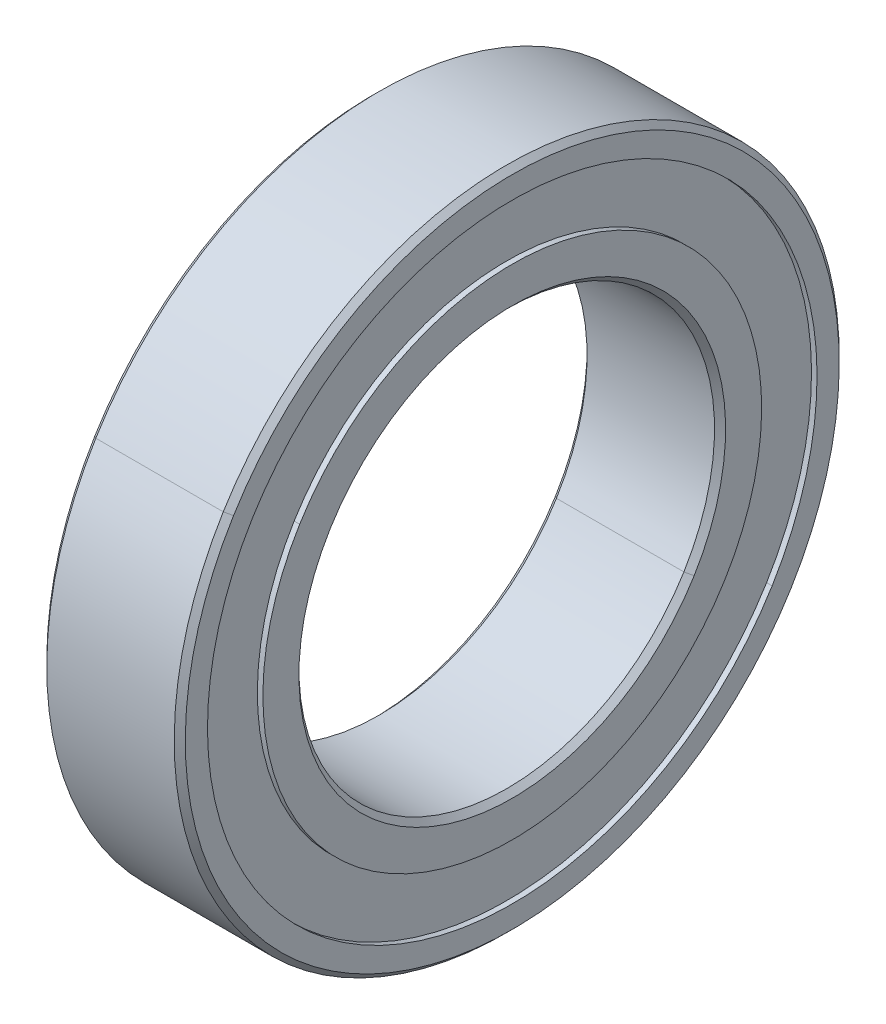
ISO-10303-21;
HEADER;
FILE_DESCRIPTION(('STEP AP214'),'2;1');
FILE_NAME('part.step','',(''),(''),'','','');
FILE_SCHEMA(('AUTOMOTIVE_DESIGN { 1 0 10303 214 1 1 1 1 }'));
ENDSEC;
DATA;
#1=APPLICATION_CONTEXT('core data for automotive mechanical design processes');
#2=APPLICATION_PROTOCOL_DEFINITION('international standard','automotive_design',2000,#1);
#3=PRODUCT_CONTEXT('',#1,'mechanical');
#4=PRODUCT('Part','Part','',(#3));
#5=PRODUCT_RELATED_PRODUCT_CATEGORY('part','',(#4));
#6=PRODUCT_DEFINITION_FORMATION('','',#4);
#7=PRODUCT_DEFINITION_CONTEXT('part definition',#1,'design');
#8=PRODUCT_DEFINITION('design','',#6,#7);
#9=PRODUCT_DEFINITION_SHAPE('','',#8);
#10=(LENGTH_UNIT() NAMED_UNIT(*) SI_UNIT(.MILLI.,.METRE.));
#11=(NAMED_UNIT(*) PLANE_ANGLE_UNIT() SI_UNIT($,.RADIAN.));
#12=(NAMED_UNIT(*) SI_UNIT($,.STERADIAN.) SOLID_ANGLE_UNIT());
#13=UNCERTAINTY_MEASURE_WITH_UNIT(LENGTH_MEASURE(1.E-05),#10,'distance_accuracy_value','');
#14=(GEOMETRIC_REPRESENTATION_CONTEXT(3) GLOBAL_UNCERTAINTY_ASSIGNED_CONTEXT((#13)) GLOBAL_UNIT_ASSIGNED_CONTEXT((#10,
#11,#12)) REPRESENTATION_CONTEXT('',''));
#15=CARTESIAN_POINT('',(0.,0.,0.));
#16=DIRECTION('',(0.,0.,1.));
#17=DIRECTION('',(1.,0.,0.));
#18=AXIS2_PLACEMENT_3D('',#15,#16,#17);
#19=CARTESIAN_POINT('',(116.025365407897,-3.49546780409327E-13,20.5000000000003));
#20=DIRECTION('',(-1.,0.,0.));
#21=DIRECTION('',(0.,0.522593110469581,0.852582219430906));
#22=AXIS2_PLACEMENT_3D('',#19,#20,#21);
#23=CONICAL_SURFACE('',#22,7.7,0.785398163397443);
#24=DIRECTION('',(-0.707106781186551,-0.36952913221441,-0.602866668878668));
#25=VECTOR('',#24,1.);
#26=CARTESIAN_POINT('',(116.025365407897,-4.02396695061612,13.9351169103823));
#27=LINE('',#26,#25);
#28=CARTESIAN_POINT('',(116.225365407897,-3.9194483285222,14.1056333542685));
#29=VERTEX_POINT('',#28);
#30=CARTESIAN_POINT('',(116.025365407897,-4.02396695061612,13.9351169103823));
#31=VERTEX_POINT('',#30);
#32=EDGE_CURVE('E402',#29,#31,#27,.T.);
#33=ORIENTED_EDGE('',*,*,#32,.F.);
#34=CARTESIAN_POINT('',(116.225365407897,-3.49346780409327E-13,20.5000000000003));
#35=DIRECTION('',(-1.,0.,0.));
#36=DIRECTION('',(0.,-0.522593110469581,-0.852582219430906));
#37=AXIS2_PLACEMENT_3D('',#34,#35,#36);
#38=CIRCLE('',#37,7.5);
#39=CARTESIAN_POINT('',(116.225365407897,3.91944832852151,26.894366645732));
#40=VERTEX_POINT('',#39);
#41=EDGE_CURVE('E271',#40,#29,#38,.T.);
#42=ORIENTED_EDGE('',*,*,#41,.F.);
#43=DIRECTION('',(-0.707106781186551,0.369529132214409,0.602866668878669));
#44=VECTOR('',#43,1.);
#45=CARTESIAN_POINT('',(116.025365407897,4.02396695061542,27.0648830896182));
#46=LINE('',#45,#44);
#47=CARTESIAN_POINT('',(116.025365407897,4.02396695061542,27.0648830896182));
#48=VERTEX_POINT('',#47);
#49=EDGE_CURVE('E415',#40,#48,#46,.T.);
#50=ORIENTED_EDGE('',*,*,#49,.T.);
#51=CARTESIAN_POINT('',(116.025365407897,-3.49546780409327E-13,20.5000000000003));
#52=DIRECTION('',(1.,0.,0.));
#53=DIRECTION('',(0.,-0.522593110469581,-0.852582219430906));
#54=AXIS2_PLACEMENT_3D('',#51,#52,#53);
#55=CIRCLE('',#54,7.7);
#56=EDGE_CURVE('E355',#31,#48,#55,.T.);
#57=ORIENTED_EDGE('',*,*,#56,.F.);
#58=EDGE_LOOP('',(#33,#42,#50,#57));
#59=FACE_BOUND('',#58,.T.);
#60=ADVANCED_FACE('F50',(#59),#23,.F.);
#61=CARTESIAN_POINT('',(120.825365407897,-3.44746780409327E-13,20.5000000000003));
#62=DIRECTION('',(1.,0.,0.));
#63=DIRECTION('',(0.,-0.522593110469581,-0.852582219430906));
#64=AXIS2_PLACEMENT_3D('',#61,#62,#63);
#65=CONICAL_SURFACE('',#64,7.5,0.785398163397443);
#66=DIRECTION('',(0.707106781186551,0.36952913221441,0.602866668878667));
#67=VECTOR('',#66,1.);
#68=CARTESIAN_POINT('',(120.825365407897,3.91944832852151,26.894366645732));
#69=LINE('',#68,#67);
#70=CARTESIAN_POINT('',(120.825365407897,3.91944832852151,26.894366645732));
#71=VERTEX_POINT('',#70);
#72=CARTESIAN_POINT('',(121.025365407897,4.02396695061543,27.0648830896182));
#73=VERTEX_POINT('',#72);
#74=EDGE_CURVE('E222',#71,#73,#69,.T.);
#75=ORIENTED_EDGE('',*,*,#74,.F.);
#76=CARTESIAN_POINT('',(120.825365407897,-3.44746780409327E-13,20.5000000000003));
#77=DIRECTION('',(1.,0.,0.));
#78=DIRECTION('',(0.,-0.522593110469581,-0.852582219430906));
#79=AXIS2_PLACEMENT_3D('',#76,#77,#78);
#80=CIRCLE('',#79,7.5);
#81=CARTESIAN_POINT('',(120.825365407897,-3.9194483285222,14.1056333542685));
#82=VERTEX_POINT('',#81);
#83=EDGE_CURVE('E213',#82,#71,#80,.T.);
#84=ORIENTED_EDGE('',*,*,#83,.F.);
#85=DIRECTION('',(0.707106781186551,-0.369529132214409,-0.602866668878669));
#86=VECTOR('',#85,1.);
#87=CARTESIAN_POINT('',(120.825365407897,-3.9194483285222,14.1056333542685));
#88=LINE('',#87,#86);
#89=CARTESIAN_POINT('',(121.025365407897,-4.02396695061611,13.9351169103823));
#90=VERTEX_POINT('',#89);
#91=EDGE_CURVE('E211',#82,#90,#88,.T.);
#92=ORIENTED_EDGE('',*,*,#91,.T.);
#93=CARTESIAN_POINT('',(121.025365407897,-3.44546780409327E-13,20.5000000000003));
#94=DIRECTION('',(-1.,0.,0.));
#95=DIRECTION('',(0.,-0.522593110469581,-0.852582219430906));
#96=AXIS2_PLACEMENT_3D('',#93,#94,#95);
#97=CIRCLE('',#96,7.7);
#98=EDGE_CURVE('E197',#73,#90,#97,.T.);
#99=ORIENTED_EDGE('',*,*,#98,.F.);
#100=EDGE_LOOP('',(#75,#84,#92,#99));
#101=FACE_BOUND('',#100,.T.);
#102=ADVANCED_FACE('F212',(#101),#65,.F.);
#103=CARTESIAN_POINT('',(116.225365407897,-3.49346780409327E-13,20.5000000000003));
#104=DIRECTION('',(1.,0.,0.));
#105=DIRECTION('',(0.,-0.522593110469581,-0.852582219430906));
#106=AXIS2_PLACEMENT_3D('',#103,#104,#105);
#107=CONICAL_SURFACE('',#106,12.,0.785398163397448);
#108=DIRECTION('',(0.707106781186548,0.369529132214412,0.60286666887867));
#109=VECTOR('',#108,1.);
#110=CARTESIAN_POINT('',(116.225365407897,6.27111732563462,30.7309866331711));
#111=LINE('',#110,#109);
#112=CARTESIAN_POINT('',(116.025365407897,6.1665987035407,30.5604701892849));
#113=VERTEX_POINT('',#112);
#114=CARTESIAN_POINT('',(116.225365407897,6.27111732563462,30.7309866331711));
#115=VERTEX_POINT('',#114);
#116=EDGE_CURVE('E233',#113,#115,#111,.T.);
#117=ORIENTED_EDGE('',*,*,#116,.F.);
#118=CARTESIAN_POINT('',(116.025365407897,-3.49546780409327E-13,20.5000000000003));
#119=DIRECTION('',(-1.,0.,0.));
#120=DIRECTION('',(0.,-0.522593110469581,-0.852582219430906));
#121=AXIS2_PLACEMENT_3D('',#118,#119,#120);
#122=CIRCLE('',#121,11.8);
#123=CARTESIAN_POINT('',(116.025365407897,-6.1665987035414,10.4395298107156));
#124=VERTEX_POINT('',#123);
#125=EDGE_CURVE('E286',#124,#113,#122,.T.);
#126=ORIENTED_EDGE('',*,*,#125,.F.);
#127=DIRECTION('',(0.707106781186548,-0.369529132214411,-0.602866668878671));
#128=VECTOR('',#127,1.);
#129=CARTESIAN_POINT('',(116.225365407897,-6.27111732563532,10.2690133668294));
#130=LINE('',#129,#128);
#131=CARTESIAN_POINT('',(116.225365407897,-6.27111732563531,10.2690133668294));
#132=VERTEX_POINT('',#131);
#133=EDGE_CURVE('E256',#124,#132,#130,.T.);
#134=ORIENTED_EDGE('',*,*,#133,.T.);
#135=CARTESIAN_POINT('',(116.225365407897,-3.49346780409327E-13,20.5000000000003));
#136=DIRECTION('',(1.,0.,0.));
#137=DIRECTION('',(0.,-0.522593110469581,-0.852582219430906));
#138=AXIS2_PLACEMENT_3D('',#135,#136,#137);
#139=CIRCLE('',#138,12.);
#140=EDGE_CURVE('E283',#115,#132,#139,.T.);
#141=ORIENTED_EDGE('',*,*,#140,.F.);
#142=EDGE_LOOP('',(#117,#126,#134,#141));
#143=FACE_BOUND('',#142,.T.);
#144=ADVANCED_FACE('F399',(#143),#107,.T.);
#145=CARTESIAN_POINT('',(121.025365407897,-3.44546780409327E-13,20.5000000000003));
#146=DIRECTION('',(-1.,0.,0.));
#147=DIRECTION('',(0.,0.522593110469581,0.852582219430906));
#148=AXIS2_PLACEMENT_3D('',#145,#146,#147);
#149=CONICAL_SURFACE('',#148,11.8,0.785398163397435);
#150=DIRECTION('',(-0.707106781186557,-0.369529132214407,-0.602866668878662));
#151=VECTOR('',#150,1.);
#152=CARTESIAN_POINT('',(121.025365407897,-6.16659870354139,10.4395298107156));
#153=LINE('',#152,#151);
#154=CARTESIAN_POINT('',(121.025365407897,-6.16659870354139,10.4395298107156));
#155=VERTEX_POINT('',#154);
#156=CARTESIAN_POINT('',(120.825365407897,-6.27111732563531,10.2690133668294));
#157=VERTEX_POINT('',#156);
#158=EDGE_CURVE('E270',#155,#157,#153,.T.);
#159=ORIENTED_EDGE('',*,*,#158,.F.);
#160=CARTESIAN_POINT('',(121.025365407897,-3.44546780409327E-13,20.5000000000003));
#161=DIRECTION('',(1.,0.,0.));
#162=DIRECTION('',(0.,-0.522593110469581,-0.852582219430906));
#163=AXIS2_PLACEMENT_3D('',#160,#161,#162);
#164=CIRCLE('',#163,11.8);
#165=CARTESIAN_POINT('',(121.025365407897,6.16659870354071,30.5604701892849));
#166=VERTEX_POINT('',#165);
#167=EDGE_CURVE('E207',#166,#155,#164,.T.);
#168=ORIENTED_EDGE('',*,*,#167,.F.);
#169=DIRECTION('',(-0.707106781186557,0.369529132214405,0.602866668878663));
#170=VECTOR('',#169,1.);
#171=CARTESIAN_POINT('',(121.025365407897,6.16659870354071,30.5604701892849));
#172=LINE('',#171,#170);
#173=CARTESIAN_POINT('',(120.825365407897,6.27111732563462,30.7309866331711));
#174=VERTEX_POINT('',#173);
#175=EDGE_CURVE('E257',#166,#174,#172,.T.);
#176=ORIENTED_EDGE('',*,*,#175,.T.);
#177=CARTESIAN_POINT('',(120.825365407897,-3.44746780409327E-13,20.5000000000003));
#178=DIRECTION('',(-1.,0.,0.));
#179=DIRECTION('',(0.,-0.522593110469581,-0.852582219430906));
#180=AXIS2_PLACEMENT_3D('',#177,#178,#179);
#181=CIRCLE('',#180,12.);
#182=EDGE_CURVE('E334',#157,#174,#181,.T.);
#183=ORIENTED_EDGE('',*,*,#182,.F.);
#184=EDGE_LOOP('',(#159,#168,#176,#183));
#185=FACE_BOUND('',#184,.T.);
#186=ADVANCED_FACE('F447',(#185),#149,.T.);
#187=CARTESIAN_POINT('',(116.225365407897,-3.49346780409327E-13,20.5000000000003));
#188=DIRECTION('',(-1.,0.,0.));
#189=DIRECTION('',(0.,0.522593110469581,0.852582219430906));
#190=AXIS2_PLACEMENT_3D('',#187,#188,#189);
#191=CYLINDRICAL_SURFACE('',#190,9.);
#192=DIRECTION('',(-1.,0.,0.));
#193=VECTOR('',#192,1.);
#194=CARTESIAN_POINT('',(116.225365407897,-4.70333799422657,12.8267600251221));
#195=LINE('',#194,#193);
#196=CARTESIAN_POINT('',(116.225365407897,-4.70333799422657,12.8267600251221));
#197=VERTEX_POINT('',#196);
#198=CARTESIAN_POINT('',(116.025365407897,-4.70333799422657,12.8267600251221));
#199=VERTEX_POINT('',#198);
#200=EDGE_CURVE('E290',#197,#199,#195,.T.);
#201=ORIENTED_EDGE('',*,*,#200,.F.);
#202=CARTESIAN_POINT('',(116.225365407897,-3.49346780409327E-13,20.5000000000003));
#203=DIRECTION('',(-1.,0.,0.));
#204=DIRECTION('',(0.,0.522593110469581,0.852582219430906));
#205=AXIS2_PLACEMENT_3D('',#202,#203,#204);
#206=CIRCLE('',#205,9.);
#207=CARTESIAN_POINT('',(116.225365407897,4.70333799422588,28.1732399748784));
#208=VERTEX_POINT('',#207);
#209=EDGE_CURVE('E11',#197,#208,#206,.T.);
#210=ORIENTED_EDGE('',*,*,#209,.T.);
#211=DIRECTION('',(-1.,0.,0.));
#212=VECTOR('',#211,1.);
#213=CARTESIAN_POINT('',(116.225365407897,4.70333799422588,28.1732399748784));
#214=LINE('',#213,#212);
#215=CARTESIAN_POINT('',(116.025365407897,4.70333799422588,28.1732399748784));
#216=VERTEX_POINT('',#215);
#217=EDGE_CURVE('E298',#208,#216,#214,.T.);
#218=ORIENTED_EDGE('',*,*,#217,.T.);
#219=CARTESIAN_POINT('',(116.025365407897,-3.49546780409327E-13,20.5000000000003));
#220=DIRECTION('',(-1.,0.,0.));
#221=DIRECTION('',(0.,0.522593110469581,0.852582219430906));
#222=AXIS2_PLACEMENT_3D('',#219,#220,#221);
#223=CIRCLE('',#222,9.);
#224=EDGE_CURVE('E352',#199,#216,#223,.T.);
#225=ORIENTED_EDGE('',*,*,#224,.F.);
#226=EDGE_LOOP('',(#201,#210,#218,#225));
#227=FACE_BOUND('',#226,.T.);
#228=ADVANCED_FACE('F484',(#227),#191,.T.);
#229=CARTESIAN_POINT('',(116.225365407897,-3.49346780409327E-13,20.5000000000003));
#230=DIRECTION('',(-1.,0.,0.));
#231=DIRECTION('',(0.,0.522593110469581,0.852582219430906));
#232=AXIS2_PLACEMENT_3D('',#229,#230,#231);
#233=PLANE('',#232);
#234=CARTESIAN_POINT('',(116.225365407897,-3.49346780409327E-13,20.5000000000003));
#235=DIRECTION('',(-1.,0.,0.));
#236=DIRECTION('',(0.,0.522593110469581,0.852582219430906));
#237=AXIS2_PLACEMENT_3D('',#234,#235,#236);
#238=CIRCLE('',#237,9.);
#239=EDGE_CURVE('E261',#208,#197,#238,.T.);
#240=ORIENTED_EDGE('',*,*,#239,.F.);
#241=ORIENTED_EDGE('',*,*,#209,.F.);
#242=EDGE_LOOP('',(#240,#241));
#243=FACE_BOUND('',#242,.T.);
#244=CARTESIAN_POINT('',(116.225365407897,-3.49346780409327E-13,20.5000000000003));
#245=DIRECTION('',(-1.,0.,0.));
#246=DIRECTION('',(0.,0.522593110469581,0.852582219430906));
#247=AXIS2_PLACEMENT_3D('',#244,#245,#246);
#248=CIRCLE('',#247,11.);
#249=CARTESIAN_POINT('',(116.225365407897,5.74852421516504,29.8784044137402));
#250=VERTEX_POINT('',#249);
#251=CARTESIAN_POINT('',(116.225365407897,-5.74852421516573,11.1215955862603));
#252=VERTEX_POINT('',#251);
#253=EDGE_CURVE('E59',#250,#252,#248,.T.);
#254=ORIENTED_EDGE('',*,*,#253,.T.);
#255=CARTESIAN_POINT('',(116.225365407897,-3.49346780409327E-13,20.5000000000003));
#256=DIRECTION('',(-1.,0.,0.));
#257=DIRECTION('',(0.,0.522593110469581,0.852582219430906));
#258=AXIS2_PLACEMENT_3D('',#255,#256,#257);
#259=CIRCLE('',#258,11.);
#260=EDGE_CURVE('E302',#252,#250,#259,.T.);
#261=ORIENTED_EDGE('',*,*,#260,.T.);
#262=EDGE_LOOP('',(#254,#261));
#263=FACE_BOUND('',#262,.T.);
#264=ADVANCED_FACE('F480',(#243,#263),#233,.T.);
#265=CARTESIAN_POINT('',(116.225365407897,-3.49346780409327E-13,20.5000000000003));
#266=DIRECTION('',(-1.,0.,0.));
#267=DIRECTION('',(0.,0.522593110469581,0.852582219430906));
#268=AXIS2_PLACEMENT_3D('',#265,#266,#267);
#269=CYLINDRICAL_SURFACE('',#268,11.);
#270=DIRECTION('',(-1.,0.,0.));
#271=VECTOR('',#270,1.);
#272=CARTESIAN_POINT('',(116.225365407897,-5.74852421516573,11.1215955862603));
#273=LINE('',#272,#271);
#274=CARTESIAN_POINT('',(116.025365407897,-5.74852421516573,11.1215955862603));
#275=VERTEX_POINT('',#274);
#276=EDGE_CURVE('E306',#252,#275,#273,.T.);
#277=ORIENTED_EDGE('',*,*,#276,.F.);
#278=ORIENTED_EDGE('',*,*,#253,.F.);
#279=DIRECTION('',(-1.,0.,0.));
#280=VECTOR('',#279,1.);
#281=CARTESIAN_POINT('',(116.225365407897,5.74852421516504,29.8784044137402));
#282=LINE('',#281,#280);
#283=CARTESIAN_POINT('',(116.025365407897,5.74852421516504,29.8784044137402));
#284=VERTEX_POINT('',#283);
#285=EDGE_CURVE('E238',#250,#284,#282,.T.);
#286=ORIENTED_EDGE('',*,*,#285,.T.);
#287=CARTESIAN_POINT('',(116.025365407897,-3.49546780409327E-13,20.5000000000003));
#288=DIRECTION('',(-1.,0.,0.));
#289=DIRECTION('',(0.,0.522593110469581,0.852582219430906));
#290=AXIS2_PLACEMENT_3D('',#287,#288,#289);
#291=CIRCLE('',#290,11.);
#292=EDGE_CURVE('E331',#284,#275,#291,.T.);
#293=ORIENTED_EDGE('',*,*,#292,.T.);
#294=EDGE_LOOP('',(#277,#278,#286,#293));
#295=FACE_BOUND('',#294,.T.);
#296=ADVANCED_FACE('F390',(#295),#269,.F.);
#297=CARTESIAN_POINT('',(120.825365407897,-3.44746780409327E-13,20.5000000000003));
#298=DIRECTION('',(1.,0.,0.));
#299=DIRECTION('',(0.,-0.522593110469581,-0.852582219430906));
#300=AXIS2_PLACEMENT_3D('',#297,#298,#299);
#301=CYLINDRICAL_SURFACE('',#300,9.);
#302=DIRECTION('',(1.,0.,0.));
#303=VECTOR('',#302,1.);
#304=CARTESIAN_POINT('',(120.825365407897,4.70333799422588,28.1732399748784));
#305=LINE('',#304,#303);
#306=CARTESIAN_POINT('',(120.825365407897,4.70333799422588,28.1732399748784));
#307=VERTEX_POINT('',#306);
#308=CARTESIAN_POINT('',(121.025365407897,4.70333799422588,28.1732399748784));
#309=VERTEX_POINT('',#308);
#310=EDGE_CURVE('E322',#307,#309,#305,.T.);
#311=ORIENTED_EDGE('',*,*,#310,.F.);
#312=CARTESIAN_POINT('',(120.825365407897,-3.44746780409327E-13,20.5000000000003));
#313=DIRECTION('',(1.,0.,0.));
#314=DIRECTION('',(0.,-0.522593110469581,-0.852582219430906));
#315=AXIS2_PLACEMENT_3D('',#312,#313,#314);
#316=CIRCLE('',#315,9.);
#317=CARTESIAN_POINT('',(120.825365407897,-4.70333799422657,12.8267600251221));
#318=VERTEX_POINT('',#317);
#319=EDGE_CURVE('E53',#307,#318,#316,.T.);
#320=ORIENTED_EDGE('',*,*,#319,.T.);
#321=DIRECTION('',(1.,0.,0.));
#322=VECTOR('',#321,1.);
#323=CARTESIAN_POINT('',(120.825365407897,-4.70333799422657,12.8267600251221));
#324=LINE('',#323,#322);
#325=CARTESIAN_POINT('',(121.025365407897,-4.70333799422657,12.8267600251221));
#326=VERTEX_POINT('',#325);
#327=EDGE_CURVE('E330',#318,#326,#324,.T.);
#328=ORIENTED_EDGE('',*,*,#327,.T.);
#329=CARTESIAN_POINT('',(121.025365407897,-3.44546780409327E-13,20.5000000000003));
#330=DIRECTION('',(1.,0.,0.));
#331=DIRECTION('',(0.,-0.522593110469581,-0.852582219430906));
#332=AXIS2_PLACEMENT_3D('',#329,#330,#331);
#333=CIRCLE('',#332,9.);
#334=EDGE_CURVE('E208',#309,#326,#333,.T.);
#335=ORIENTED_EDGE('',*,*,#334,.F.);
#336=EDGE_LOOP('',(#311,#320,#328,#335));
#337=FACE_BOUND('',#336,.T.);
#338=ADVANCED_FACE('F374',(#337),#301,.T.);
#339=CARTESIAN_POINT('',(120.825365407897,-3.44746780409327E-13,20.5000000000003));
#340=DIRECTION('',(1.,0.,0.));
#341=DIRECTION('',(0.,0.852582219430906,-0.522593110469581));
#342=AXIS2_PLACEMENT_3D('',#339,#340,#341);
#343=PLANE('',#342);
#344=CARTESIAN_POINT('',(120.825365407897,-3.44746780409327E-13,20.5000000000003));
#345=DIRECTION('',(1.,0.,0.));
#346=DIRECTION('',(0.,-0.522593110469581,-0.852582219430906));
#347=AXIS2_PLACEMENT_3D('',#344,#345,#346);
#348=CIRCLE('',#347,9.);
#349=EDGE_CURVE('E242',#318,#307,#348,.T.);
#350=ORIENTED_EDGE('',*,*,#349,.F.);
#351=ORIENTED_EDGE('',*,*,#319,.F.);
#352=EDGE_LOOP('',(#350,#351));
#353=FACE_BOUND('',#352,.T.);
#354=CARTESIAN_POINT('',(120.825365407897,-3.44746780409327E-13,20.5000000000003));
#355=DIRECTION('',(1.,0.,0.));
#356=DIRECTION('',(0.,-0.522593110469581,-0.852582219430906));
#357=AXIS2_PLACEMENT_3D('',#354,#355,#356);
#358=CIRCLE('',#357,11.);
#359=CARTESIAN_POINT('',(120.825365407897,-5.74852421516573,11.1215955862603));
#360=VERTEX_POINT('',#359);
#361=CARTESIAN_POINT('',(120.825365407897,5.74852421516504,29.8784044137402));
#362=VERTEX_POINT('',#361);
#363=EDGE_CURVE('E274',#360,#362,#358,.T.);
#364=ORIENTED_EDGE('',*,*,#363,.T.);
#365=CARTESIAN_POINT('',(120.825365407897,-3.44746780409327E-13,20.5000000000003));
#366=DIRECTION('',(1.,0.,0.));
#367=DIRECTION('',(0.,-0.522593110469581,-0.852582219430906));
#368=AXIS2_PLACEMENT_3D('',#365,#366,#367);
#369=CIRCLE('',#368,11.);
#370=EDGE_CURVE('E252',#362,#360,#369,.T.);
#371=ORIENTED_EDGE('',*,*,#370,.T.);
#372=EDGE_LOOP('',(#364,#371));
#373=FACE_BOUND('',#372,.T.);
#374=ADVANCED_FACE('F380',(#353,#373),#343,.T.);
#375=CARTESIAN_POINT('',(120.825365407897,-3.44746780409327E-13,20.5000000000003));
#376=DIRECTION('',(1.,0.,0.));
#377=DIRECTION('',(0.,-0.522593110469581,-0.852582219430906));
#378=AXIS2_PLACEMENT_3D('',#375,#376,#377);
#379=CYLINDRICAL_SURFACE('',#378,11.);
#380=DIRECTION('',(1.,0.,0.));
#381=VECTOR('',#380,1.);
#382=CARTESIAN_POINT('',(120.825365407897,5.74852421516504,29.8784044137402));
#383=LINE('',#382,#381);
#384=CARTESIAN_POINT('',(121.025365407897,5.74852421516504,29.8784044137402));
#385=VERTEX_POINT('',#384);
#386=EDGE_CURVE('E247',#362,#385,#383,.T.);
#387=ORIENTED_EDGE('',*,*,#386,.F.);
#388=ORIENTED_EDGE('',*,*,#363,.F.);
#389=DIRECTION('',(1.,0.,0.));
#390=VECTOR('',#389,1.);
#391=CARTESIAN_POINT('',(120.825365407897,-5.74852421516573,11.1215955862603));
#392=LINE('',#391,#390);
#393=CARTESIAN_POINT('',(121.025365407897,-5.74852421516573,11.1215955862603));
#394=VERTEX_POINT('',#393);
#395=EDGE_CURVE('E344',#360,#394,#392,.T.);
#396=ORIENTED_EDGE('',*,*,#395,.T.);
#397=CARTESIAN_POINT('',(121.025365407897,-3.44546780409327E-13,20.5000000000003));
#398=DIRECTION('',(1.,0.,0.));
#399=DIRECTION('',(0.,-0.522593110469581,-0.852582219430906));
#400=AXIS2_PLACEMENT_3D('',#397,#398,#399);
#401=CIRCLE('',#400,11.);
#402=EDGE_CURVE('E69',#394,#385,#401,.T.);
#403=ORIENTED_EDGE('',*,*,#402,.T.);
#404=EDGE_LOOP('',(#387,#388,#396,#403));
#405=FACE_BOUND('',#404,.T.);
#406=ADVANCED_FACE('F382',(#405),#379,.F.);
#407=CARTESIAN_POINT('',(121.025365407897,-3.44546780409327E-13,20.5000000000003));
#408=DIRECTION('',(-1.,0.,0.));
#409=DIRECTION('',(0.,0.522593110469581,0.852582219430906));
#410=AXIS2_PLACEMENT_3D('',#407,#408,#409);
#411=CYLINDRICAL_SURFACE('',#410,7.5);
#412=DIRECTION('',(-1.,0.,0.));
#413=VECTOR('',#412,1.);
#414=CARTESIAN_POINT('',(121.025365407897,-3.9194483285222,14.1056333542685));
#415=LINE('',#414,#413);
#416=EDGE_CURVE('E318',#82,#29,#415,.T.);
#417=ORIENTED_EDGE('',*,*,#416,.F.);
#418=ORIENTED_EDGE('',*,*,#83,.T.);
#419=DIRECTION('',(-1.,0.,0.));
#420=VECTOR('',#419,1.);
#421=CARTESIAN_POINT('',(121.025365407897,3.91944832852151,26.894366645732));
#422=LINE('',#421,#420);
#423=EDGE_CURVE('E313',#71,#40,#422,.T.);
#424=ORIENTED_EDGE('',*,*,#423,.T.);
#425=ORIENTED_EDGE('',*,*,#41,.T.);
#426=EDGE_LOOP('',(#417,#418,#424,#425));
#427=FACE_BOUND('',#426,.T.);
#428=ADVANCED_FACE('F388',(#427),#411,.F.);
#429=CARTESIAN_POINT('',(121.025365407897,-3.44546780409327E-13,20.5000000000003));
#430=DIRECTION('',(-1.,0.,0.));
#431=DIRECTION('',(0.,0.522593110469581,0.852582219430906));
#432=AXIS2_PLACEMENT_3D('',#429,#430,#431);
#433=CYLINDRICAL_SURFACE('',#432,12.);
#434=DIRECTION('',(-1.,0.,0.));
#435=VECTOR('',#434,1.);
#436=CARTESIAN_POINT('',(121.025365407897,-6.27111732563531,10.2690133668294));
#437=LINE('',#436,#435);
#438=EDGE_CURVE('E317',#157,#132,#437,.T.);
#439=ORIENTED_EDGE('',*,*,#438,.F.);
#440=ORIENTED_EDGE('',*,*,#182,.T.);
#441=DIRECTION('',(-1.,0.,0.));
#442=VECTOR('',#441,1.);
#443=CARTESIAN_POINT('',(121.025365407897,6.27111732563462,30.7309866331711));
#444=LINE('',#443,#442);
#445=EDGE_CURVE('E348',#174,#115,#444,.T.);
#446=ORIENTED_EDGE('',*,*,#445,.T.);
#447=ORIENTED_EDGE('',*,*,#140,.T.);
#448=EDGE_LOOP('',(#439,#440,#446,#447));
#449=FACE_BOUND('',#448,.T.);
#450=ADVANCED_FACE('F457',(#449),#433,.T.);
#451=CARTESIAN_POINT('',(116.025365407897,-3.49546780409327E-13,20.5000000000003));
#452=DIRECTION('',(1.,0.,0.));
#453=DIRECTION('',(0.,0.852582219430906,-0.522593110469581));
#454=AXIS2_PLACEMENT_3D('',#451,#452,#453);
#455=PLANE('',#454);
#456=ORIENTED_EDGE('',*,*,#292,.F.);
#457=CARTESIAN_POINT('',(116.025365407897,-3.49546780409327E-13,20.5000000000003));
#458=DIRECTION('',(-1.,0.,0.));
#459=DIRECTION('',(0.,0.522593110469581,0.852582219430906));
#460=AXIS2_PLACEMENT_3D('',#457,#458,#459);
#461=CIRCLE('',#460,11.);
#462=EDGE_CURVE('E243',#275,#284,#461,.T.);
#463=ORIENTED_EDGE('',*,*,#462,.F.);
#464=EDGE_LOOP('',(#456,#463));
#465=FACE_BOUND('',#464,.T.);
#466=ORIENTED_EDGE('',*,*,#125,.T.);
#467=CARTESIAN_POINT('',(116.025365407897,-3.49546780409327E-13,20.5000000000003));
#468=DIRECTION('',(-1.,0.,0.));
#469=DIRECTION('',(0.,-0.522593110469581,-0.852582219430906));
#470=AXIS2_PLACEMENT_3D('',#467,#468,#469);
#471=CIRCLE('',#470,11.8);
#472=EDGE_CURVE('E219',#113,#124,#471,.T.);
#473=ORIENTED_EDGE('',*,*,#472,.T.);
#474=EDGE_LOOP('',(#466,#473));
#475=FACE_BOUND('',#474,.T.);
#476=ADVANCED_FACE('F441',(#465,#475),#455,.F.);
#477=CARTESIAN_POINT('',(121.025365407897,-3.44546780409327E-13,20.5000000000003));
#478=DIRECTION('',(1.,0.,0.));
#479=DIRECTION('',(0.,0.852582219430906,-0.522593110469581));
#480=AXIS2_PLACEMENT_3D('',#477,#478,#479);
#481=PLANE('',#480);
#482=ORIENTED_EDGE('',*,*,#402,.F.);
#483=CARTESIAN_POINT('',(121.025365407897,-3.44546780409327E-13,20.5000000000003));
#484=DIRECTION('',(1.,0.,0.));
#485=DIRECTION('',(0.,-0.522593110469581,-0.852582219430906));
#486=AXIS2_PLACEMENT_3D('',#483,#484,#485);
#487=CIRCLE('',#486,11.);
#488=EDGE_CURVE('E251',#385,#394,#487,.T.);
#489=ORIENTED_EDGE('',*,*,#488,.F.);
#490=EDGE_LOOP('',(#482,#489));
#491=FACE_BOUND('',#490,.T.);
#492=ORIENTED_EDGE('',*,*,#167,.T.);
#493=CARTESIAN_POINT('',(121.025365407897,-3.44546780409327E-13,20.5000000000003));
#494=DIRECTION('',(1.,0.,0.));
#495=DIRECTION('',(0.,-0.522593110469581,-0.852582219430906));
#496=AXIS2_PLACEMENT_3D('',#493,#494,#495);
#497=CIRCLE('',#496,11.8);
#498=EDGE_CURVE('E266',#155,#166,#497,.T.);
#499=ORIENTED_EDGE('',*,*,#498,.T.);
#500=EDGE_LOOP('',(#492,#499));
#501=FACE_BOUND('',#500,.T.);
#502=ADVANCED_FACE('F438',(#491,#501),#481,.T.);
#503=CARTESIAN_POINT('',(121.025365407897,-3.44546780409327E-13,20.5000000000003));
#504=DIRECTION('',(1.,0.,0.));
#505=DIRECTION('',(0.,0.852582219430906,-0.522593110469581));
#506=AXIS2_PLACEMENT_3D('',#503,#504,#505);
#507=PLANE('',#506);
#508=CARTESIAN_POINT('',(121.025365407897,-3.44546780409327E-13,20.5000000000003));
#509=DIRECTION('',(-1.,0.,0.));
#510=DIRECTION('',(0.,-0.522593110469581,-0.852582219430906));
#511=AXIS2_PLACEMENT_3D('',#508,#509,#510);
#512=CIRCLE('',#511,7.7);
#513=EDGE_CURVE('E202',#90,#73,#512,.T.);
#514=ORIENTED_EDGE('',*,*,#513,.T.);
#515=ORIENTED_EDGE('',*,*,#98,.T.);
#516=EDGE_LOOP('',(#514,#515));
#517=FACE_BOUND('',#516,.T.);
#518=CARTESIAN_POINT('',(121.025365407897,-3.44546780409327E-13,20.5000000000003));
#519=DIRECTION('',(1.,0.,0.));
#520=DIRECTION('',(0.,-0.522593110469581,-0.852582219430906));
#521=AXIS2_PLACEMENT_3D('',#518,#519,#520);
#522=CIRCLE('',#521,9.);
#523=EDGE_CURVE('E326',#326,#309,#522,.T.);
#524=ORIENTED_EDGE('',*,*,#523,.T.);
#525=ORIENTED_EDGE('',*,*,#334,.T.);
#526=EDGE_LOOP('',(#524,#525));
#527=FACE_BOUND('',#526,.T.);
#528=ADVANCED_FACE('F199',(#517,#527),#507,.T.);
#529=CARTESIAN_POINT('',(116.025365407897,-3.49546780409327E-13,20.5000000000003));
#530=DIRECTION('',(1.,0.,0.));
#531=DIRECTION('',(0.,0.852582219430906,-0.522593110469581));
#532=AXIS2_PLACEMENT_3D('',#529,#530,#531);
#533=PLANE('',#532);
#534=CARTESIAN_POINT('',(116.025365407897,-3.49546780409327E-13,20.5000000000003));
#535=DIRECTION('',(1.,0.,0.));
#536=DIRECTION('',(0.,-0.522593110469581,-0.852582219430906));
#537=AXIS2_PLACEMENT_3D('',#534,#535,#536);
#538=CIRCLE('',#537,7.7);
#539=EDGE_CURVE('E409',#48,#31,#538,.T.);
#540=ORIENTED_EDGE('',*,*,#539,.T.);
#541=ORIENTED_EDGE('',*,*,#56,.T.);
#542=EDGE_LOOP('',(#540,#541));
#543=FACE_BOUND('',#542,.T.);
#544=CARTESIAN_POINT('',(116.025365407897,-3.49546780409327E-13,20.5000000000003));
#545=DIRECTION('',(-1.,0.,0.));
#546=DIRECTION('',(0.,0.522593110469581,0.852582219430906));
#547=AXIS2_PLACEMENT_3D('',#544,#545,#546);
#548=CIRCLE('',#547,9.);
#549=EDGE_CURVE('E294',#216,#199,#548,.T.);
#550=ORIENTED_EDGE('',*,*,#549,.T.);
#551=ORIENTED_EDGE('',*,*,#224,.T.);
#552=EDGE_LOOP('',(#550,#551));
#553=FACE_BOUND('',#552,.T.);
#554=ADVANCED_FACE('F564',(#543,#553),#533,.F.);
#555=CARTESIAN_POINT('',(121.025365407897,-3.44546780409327E-13,20.5000000000003));
#556=DIRECTION('',(-1.,0.,0.));
#557=DIRECTION('',(0.,0.522593110469581,0.852582219430906));
#558=AXIS2_PLACEMENT_3D('',#555,#556,#557);
#559=CYLINDRICAL_SURFACE('',#558,12.);
#560=CARTESIAN_POINT('',(120.825365407897,-3.44746780409327E-13,20.5000000000003));
#561=DIRECTION('',(-1.,0.,0.));
#562=DIRECTION('',(0.,-0.522593110469581,-0.852582219430906));
#563=AXIS2_PLACEMENT_3D('',#560,#561,#562);
#564=CIRCLE('',#563,12.);
#565=EDGE_CURVE('E262',#174,#157,#564,.T.);
#566=ORIENTED_EDGE('',*,*,#565,.T.);
#567=ORIENTED_EDGE('',*,*,#438,.T.);
#568=CARTESIAN_POINT('',(116.225365407897,-3.49346780409327E-13,20.5000000000003));
#569=DIRECTION('',(1.,0.,0.));
#570=DIRECTION('',(0.,-0.522593110469581,-0.852582219430906));
#571=AXIS2_PLACEMENT_3D('',#568,#569,#570);
#572=CIRCLE('',#571,12.);
#573=EDGE_CURVE('E237',#132,#115,#572,.T.);
#574=ORIENTED_EDGE('',*,*,#573,.T.);
#575=ORIENTED_EDGE('',*,*,#445,.F.);
#576=EDGE_LOOP('',(#566,#567,#574,#575));
#577=FACE_BOUND('',#576,.T.);
#578=ADVANCED_FACE('F454',(#577),#559,.T.);
#579=CARTESIAN_POINT('',(121.025365407897,-3.44546780409327E-13,20.5000000000003));
#580=DIRECTION('',(-1.,0.,0.));
#581=DIRECTION('',(0.,0.522593110469581,0.852582219430906));
#582=AXIS2_PLACEMENT_3D('',#579,#580,#581);
#583=CYLINDRICAL_SURFACE('',#582,7.5);
#584=CARTESIAN_POINT('',(120.825365407897,-3.44746780409327E-13,20.5000000000003));
#585=DIRECTION('',(1.,0.,0.));
#586=DIRECTION('',(0.,-0.522593110469581,-0.852582219430906));
#587=AXIS2_PLACEMENT_3D('',#584,#585,#586);
#588=CIRCLE('',#587,7.5);
#589=EDGE_CURVE('E227',#71,#82,#588,.T.);
#590=ORIENTED_EDGE('',*,*,#589,.T.);
#591=ORIENTED_EDGE('',*,*,#416,.T.);
#592=CARTESIAN_POINT('',(116.225365407897,-3.49346780409327E-13,20.5000000000003));
#593=DIRECTION('',(-1.,0.,0.));
#594=DIRECTION('',(0.,-0.522593110469581,-0.852582219430906));
#595=AXIS2_PLACEMENT_3D('',#592,#593,#594);
#596=CIRCLE('',#595,7.5);
#597=EDGE_CURVE('E410',#29,#40,#596,.T.);
#598=ORIENTED_EDGE('',*,*,#597,.T.);
#599=ORIENTED_EDGE('',*,*,#423,.F.);
#600=EDGE_LOOP('',(#590,#591,#598,#599));
#601=FACE_BOUND('',#600,.T.);
#602=ADVANCED_FACE('F583',(#601),#583,.F.);
#603=CARTESIAN_POINT('',(120.825365407897,-3.44746780409327E-13,20.5000000000003));
#604=DIRECTION('',(1.,0.,0.));
#605=DIRECTION('',(0.,-0.522593110469581,-0.852582219430906));
#606=AXIS2_PLACEMENT_3D('',#603,#604,#605);
#607=CYLINDRICAL_SURFACE('',#606,11.);
#608=ORIENTED_EDGE('',*,*,#370,.F.);
#609=ORIENTED_EDGE('',*,*,#386,.T.);
#610=ORIENTED_EDGE('',*,*,#488,.T.);
#611=ORIENTED_EDGE('',*,*,#395,.F.);
#612=EDGE_LOOP('',(#608,#609,#610,#611));
#613=FACE_BOUND('',#612,.T.);
#614=ADVANCED_FACE('F437',(#613),#607,.F.);
#615=CARTESIAN_POINT('',(120.825365407897,-3.44746780409327E-13,20.5000000000003));
#616=DIRECTION('',(1.,0.,0.));
#617=DIRECTION('',(0.,-0.522593110469581,-0.852582219430906));
#618=AXIS2_PLACEMENT_3D('',#615,#616,#617);
#619=CYLINDRICAL_SURFACE('',#618,9.);
#620=ORIENTED_EDGE('',*,*,#349,.T.);
#621=ORIENTED_EDGE('',*,*,#310,.T.);
#622=ORIENTED_EDGE('',*,*,#523,.F.);
#623=ORIENTED_EDGE('',*,*,#327,.F.);
#624=EDGE_LOOP('',(#620,#621,#622,#623));
#625=FACE_BOUND('',#624,.T.);
#626=ADVANCED_FACE('F379',(#625),#619,.T.);
#627=CARTESIAN_POINT('',(116.225365407897,-3.49346780409327E-13,20.5000000000003));
#628=DIRECTION('',(-1.,0.,0.));
#629=DIRECTION('',(0.,0.522593110469581,0.852582219430906));
#630=AXIS2_PLACEMENT_3D('',#627,#628,#629);
#631=CYLINDRICAL_SURFACE('',#630,11.);
#632=ORIENTED_EDGE('',*,*,#260,.F.);
#633=ORIENTED_EDGE('',*,*,#276,.T.);
#634=ORIENTED_EDGE('',*,*,#462,.T.);
#635=ORIENTED_EDGE('',*,*,#285,.F.);
#636=EDGE_LOOP('',(#632,#633,#634,#635));
#637=FACE_BOUND('',#636,.T.);
#638=ADVANCED_FACE('F609',(#637),#631,.F.);
#639=CARTESIAN_POINT('',(116.225365407897,-3.49346780409327E-13,20.5000000000003));
#640=DIRECTION('',(-1.,0.,0.));
#641=DIRECTION('',(0.,0.522593110469581,0.852582219430906));
#642=AXIS2_PLACEMENT_3D('',#639,#640,#641);
#643=CYLINDRICAL_SURFACE('',#642,9.);
#644=ORIENTED_EDGE('',*,*,#239,.T.);
#645=ORIENTED_EDGE('',*,*,#200,.T.);
#646=ORIENTED_EDGE('',*,*,#549,.F.);
#647=ORIENTED_EDGE('',*,*,#217,.F.);
#648=EDGE_LOOP('',(#644,#645,#646,#647));
#649=FACE_BOUND('',#648,.T.);
#650=ADVANCED_FACE('F619',(#649),#643,.T.);
#651=CARTESIAN_POINT('',(121.025365407897,-3.44546780409327E-13,20.5000000000003));
#652=DIRECTION('',(-1.,0.,0.));
#653=DIRECTION('',(0.,0.522593110469581,0.852582219430906));
#654=AXIS2_PLACEMENT_3D('',#651,#652,#653);
#655=CONICAL_SURFACE('',#654,11.8,0.785398163397435);
#656=ORIENTED_EDGE('',*,*,#498,.F.);
#657=ORIENTED_EDGE('',*,*,#158,.T.);
#658=ORIENTED_EDGE('',*,*,#565,.F.);
#659=ORIENTED_EDGE('',*,*,#175,.F.);
#660=EDGE_LOOP('',(#656,#657,#658,#659));
#661=FACE_BOUND('',#660,.T.);
#662=ADVANCED_FACE('F451',(#661),#655,.T.);
#663=CARTESIAN_POINT('',(116.225365407897,-3.49346780409327E-13,20.5000000000003));
#664=DIRECTION('',(1.,0.,0.));
#665=DIRECTION('',(0.,-0.522593110469581,-0.852582219430906));
#666=AXIS2_PLACEMENT_3D('',#663,#664,#665);
#667=CONICAL_SURFACE('',#666,12.,0.785398163397448);
#668=ORIENTED_EDGE('',*,*,#472,.F.);
#669=ORIENTED_EDGE('',*,*,#116,.T.);
#670=ORIENTED_EDGE('',*,*,#573,.F.);
#671=ORIENTED_EDGE('',*,*,#133,.F.);
#672=EDGE_LOOP('',(#668,#669,#670,#671));
#673=FACE_BOUND('',#672,.T.);
#674=ADVANCED_FACE('F463',(#673),#667,.T.);
#675=CARTESIAN_POINT('',(120.825365407897,-3.44746780409327E-13,20.5000000000003));
#676=DIRECTION('',(1.,0.,0.));
#677=DIRECTION('',(0.,-0.522593110469581,-0.852582219430906));
#678=AXIS2_PLACEMENT_3D('',#675,#676,#677);
#679=CONICAL_SURFACE('',#678,7.5,0.785398163397443);
#680=ORIENTED_EDGE('',*,*,#589,.F.);
#681=ORIENTED_EDGE('',*,*,#74,.T.);
#682=ORIENTED_EDGE('',*,*,#513,.F.);
#683=ORIENTED_EDGE('',*,*,#91,.F.);
#684=EDGE_LOOP('',(#680,#681,#682,#683));
#685=FACE_BOUND('',#684,.T.);
#686=ADVANCED_FACE('F221',(#685),#679,.F.);
#687=CARTESIAN_POINT('',(116.025365407897,-3.49546780409327E-13,20.5000000000003));
#688=DIRECTION('',(-1.,0.,0.));
#689=DIRECTION('',(0.,0.522593110469581,0.852582219430906));
#690=AXIS2_PLACEMENT_3D('',#687,#688,#689);
#691=CONICAL_SURFACE('',#690,7.7,0.785398163397443);
#692=ORIENTED_EDGE('',*,*,#597,.F.);
#693=ORIENTED_EDGE('',*,*,#32,.T.);
#694=ORIENTED_EDGE('',*,*,#539,.F.);
#695=ORIENTED_EDGE('',*,*,#49,.F.);
#696=EDGE_LOOP('',(#692,#693,#694,#695));
#697=FACE_BOUND('',#696,.T.);
#698=ADVANCED_FACE('F414',(#697),#691,.F.);
#699=CLOSED_SHELL('',(#60,#102,#144,#186,#228,#264,#296,#338,#374,#406,#428,#450,#476,#502,#528,
#554,#578,#602,#614,#626,#638,#650,#662,#674,#686,#698));
#700=MANIFOLD_SOLID_BREP('B2',#699);
#701=ADVANCED_BREP_SHAPE_REPRESENTATION('',(#18,#700),#14);
#702=SHAPE_DEFINITION_REPRESENTATION(#9,#701);
ENDSEC;
END-ISO-10303-21;
